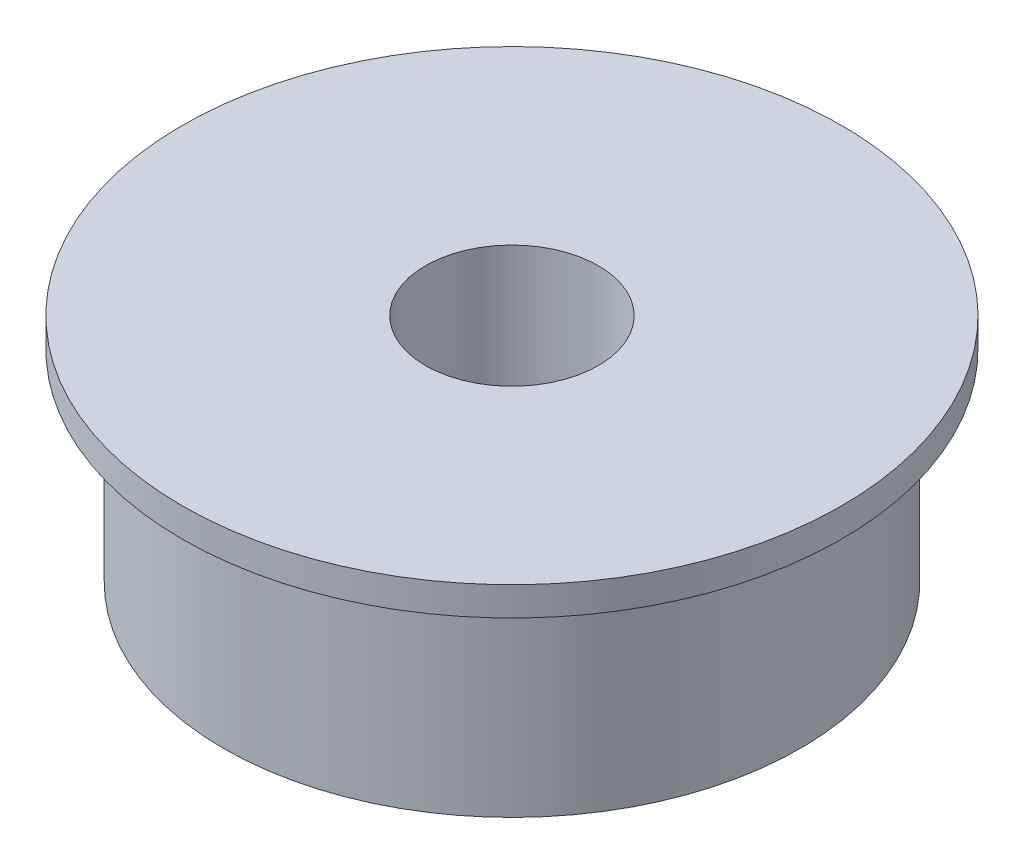
ISO-10303-21;
HEADER;
FILE_DESCRIPTION(('STEP AP214'),'2;1');
FILE_NAME('part.step','',(''),(''),'','','');
FILE_SCHEMA(('AUTOMOTIVE_DESIGN { 1 0 10303 214 1 1 1 1 }'));
ENDSEC;
DATA;
#1=APPLICATION_CONTEXT('core data for automotive mechanical design processes');
#2=APPLICATION_PROTOCOL_DEFINITION('international standard','automotive_design',2000,#1);
#3=PRODUCT_CONTEXT('',#1,'mechanical');
#4=PRODUCT('Part','Part','',(#3));
#5=PRODUCT_RELATED_PRODUCT_CATEGORY('part','',(#4));
#6=PRODUCT_DEFINITION_FORMATION('','',#4);
#7=PRODUCT_DEFINITION_CONTEXT('part definition',#1,'design');
#8=PRODUCT_DEFINITION('design','',#6,#7);
#9=PRODUCT_DEFINITION_SHAPE('','',#8);
#10=(LENGTH_UNIT() NAMED_UNIT(*) SI_UNIT(.MILLI.,.METRE.));
#11=(NAMED_UNIT(*) PLANE_ANGLE_UNIT() SI_UNIT($,.RADIAN.));
#12=(NAMED_UNIT(*) SI_UNIT($,.STERADIAN.) SOLID_ANGLE_UNIT());
#13=UNCERTAINTY_MEASURE_WITH_UNIT(LENGTH_MEASURE(1.E-05),#10,'distance_accuracy_value','');
#14=(GEOMETRIC_REPRESENTATION_CONTEXT(3) GLOBAL_UNCERTAINTY_ASSIGNED_CONTEXT((#13)) GLOBAL_UNIT_ASSIGNED_CONTEXT((#10,
#11,#12)) REPRESENTATION_CONTEXT('',''));
#15=CARTESIAN_POINT('',(0.,0.,0.));
#16=DIRECTION('',(0.,0.,1.));
#17=DIRECTION('',(1.,0.,0.));
#18=AXIS2_PLACEMENT_3D('',#15,#16,#17);
#19=CARTESIAN_POINT('',(0.,3.499993,0.));
#20=DIRECTION('',(0.,-1.,0.));
#21=DIRECTION('',(0.,0.,-1.));
#22=AXIS2_PLACEMENT_3D('',#19,#20,#21);
#23=CYLINDRICAL_SURFACE('',#22,5.);
#24=CARTESIAN_POINT('',(0.,3.499993,0.));
#25=DIRECTION('',(0.,1.,0.));
#26=DIRECTION('',(0.,0.,1.));
#27=AXIS2_PLACEMENT_3D('',#24,#25,#26);
#28=CIRCLE('',#27,5.);
#29=CARTESIAN_POINT('',(0.,3.499993,5.));
#30=VERTEX_POINT('',#29);
#31=EDGE_CURVE('E10',#30,#30,#28,.T.);
#32=ORIENTED_EDGE('',*,*,#31,.F.);
#33=EDGE_LOOP('',(#32));
#34=FACE_BOUND('',#33,.T.);
#35=CARTESIAN_POINT('',(0.,0.,0.));
#36=DIRECTION('',(0.,1.,0.));
#37=DIRECTION('',(0.,0.,1.));
#38=AXIS2_PLACEMENT_3D('',#35,#36,#37);
#39=CIRCLE('',#38,5.);
#40=CARTESIAN_POINT('',(0.,0.,5.));
#41=VERTEX_POINT('',#40);
#42=EDGE_CURVE('E34',#41,#41,#39,.T.);
#43=ORIENTED_EDGE('',*,*,#42,.T.);
#44=EDGE_LOOP('',(#43));
#45=FACE_BOUND('',#44,.T.);
#46=ADVANCED_FACE('F31',(#34,#45),#23,.T.);
#47=CARTESIAN_POINT('',(0.,0.,0.));
#48=DIRECTION('',(0.,1.,0.));
#49=DIRECTION('',(0.,0.,1.));
#50=AXIS2_PLACEMENT_3D('',#47,#48,#49);
#51=PLANE('',#50);
#52=CARTESIAN_POINT('',(0.,0.,0.));
#53=DIRECTION('',(0.,1.,0.));
#54=DIRECTION('',(0.,0.,1.));
#55=AXIS2_PLACEMENT_3D('',#52,#53,#54);
#56=CIRCLE('',#55,1.5);
#57=CARTESIAN_POINT('',(0.,0.,1.5));
#58=VERTEX_POINT('',#57);
#59=EDGE_CURVE('E46',#58,#58,#56,.F.);
#60=ORIENTED_EDGE('',*,*,#59,.F.);
#61=EDGE_LOOP('',(#60));
#62=FACE_BOUND('',#61,.T.);
#63=ORIENTED_EDGE('',*,*,#42,.F.);
#64=EDGE_LOOP('',(#63));
#65=FACE_BOUND('',#64,.T.);
#66=ADVANCED_FACE('F68',(#62,#65),#51,.F.);
#67=CARTESIAN_POINT('',(0.,4.0005,0.));
#68=DIRECTION('',(0.,-1.,0.));
#69=DIRECTION('',(0.,0.,-1.));
#70=AXIS2_PLACEMENT_3D('',#67,#68,#69);
#71=CYLINDRICAL_SURFACE('',#70,5.715);
#72=CARTESIAN_POINT('',(0.,4.0005,0.));
#73=DIRECTION('',(0.,1.,0.));
#74=DIRECTION('',(0.,0.,1.));
#75=AXIS2_PLACEMENT_3D('',#72,#73,#74);
#76=CIRCLE('',#75,5.715);
#77=CARTESIAN_POINT('',(0.,4.0005,5.715));
#78=VERTEX_POINT('',#77);
#79=EDGE_CURVE('E41',#78,#78,#76,.T.);
#80=ORIENTED_EDGE('',*,*,#79,.F.);
#81=EDGE_LOOP('',(#80));
#82=FACE_BOUND('',#81,.T.);
#83=CARTESIAN_POINT('',(0.,3.499993,0.));
#84=DIRECTION('',(0.,1.,0.));
#85=DIRECTION('',(0.,0.,1.));
#86=AXIS2_PLACEMENT_3D('',#83,#84,#85);
#87=CIRCLE('',#86,5.715);
#88=CARTESIAN_POINT('',(0.,3.499993,5.715));
#89=VERTEX_POINT('',#88);
#90=EDGE_CURVE('E43',#89,#89,#87,.T.);
#91=ORIENTED_EDGE('',*,*,#90,.T.);
#92=EDGE_LOOP('',(#91));
#93=FACE_BOUND('',#92,.T.);
#94=ADVANCED_FACE('F62',(#82,#93),#71,.T.);
#95=CARTESIAN_POINT('',(0.,4.0005,0.));
#96=DIRECTION('',(0.,1.,0.));
#97=DIRECTION('',(0.,0.,1.));
#98=AXIS2_PLACEMENT_3D('',#95,#96,#97);
#99=PLANE('',#98);
#100=CARTESIAN_POINT('',(0.,4.0005,0.));
#101=DIRECTION('',(0.,1.,0.));
#102=DIRECTION('',(0.,0.,1.));
#103=AXIS2_PLACEMENT_3D('',#100,#101,#102);
#104=CIRCLE('',#103,1.5);
#105=CARTESIAN_POINT('',(0.,4.0005,1.5));
#106=VERTEX_POINT('',#105);
#107=EDGE_CURVE('E51',#106,#106,#104,.T.);
#108=ORIENTED_EDGE('',*,*,#107,.F.);
#109=EDGE_LOOP('',(#108));
#110=FACE_BOUND('',#109,.T.);
#111=ORIENTED_EDGE('',*,*,#79,.T.);
#112=EDGE_LOOP('',(#111));
#113=FACE_BOUND('',#112,.T.);
#114=ADVANCED_FACE('F58',(#110,#113),#99,.T.);
#115=CARTESIAN_POINT('',(0.,3.499993,0.));
#116=DIRECTION('',(0.,1.,0.));
#117=DIRECTION('',(0.,0.,1.));
#118=AXIS2_PLACEMENT_3D('',#115,#116,#117);
#119=PLANE('',#118);
#120=ORIENTED_EDGE('',*,*,#31,.T.);
#121=EDGE_LOOP('',(#120));
#122=FACE_BOUND('',#121,.T.);
#123=ORIENTED_EDGE('',*,*,#90,.F.);
#124=EDGE_LOOP('',(#123));
#125=FACE_BOUND('',#124,.T.);
#126=ADVANCED_FACE('F61',(#122,#125),#119,.F.);
#127=CARTESIAN_POINT('',(0.,-0.00100000000000013,0.));
#128=DIRECTION('',(0.,1.,0.));
#129=DIRECTION('',(0.,0.,1.));
#130=AXIS2_PLACEMENT_3D('',#127,#128,#129);
#131=CYLINDRICAL_SURFACE('',#130,1.5);
#132=ORIENTED_EDGE('',*,*,#107,.T.);
#133=EDGE_LOOP('',(#132));
#134=FACE_BOUND('',#133,.T.);
#135=ORIENTED_EDGE('',*,*,#59,.T.);
#136=EDGE_LOOP('',(#135));
#137=FACE_BOUND('',#136,.T.);
#138=ADVANCED_FACE('F55',(#134,#137),#131,.F.);
#139=CLOSED_SHELL('',(#46,#66,#94,#114,#126,#138));
#140=MANIFOLD_SOLID_BREP('B2',#139);
#141=ADVANCED_BREP_SHAPE_REPRESENTATION('',(#18,#140),#14);
#142=SHAPE_DEFINITION_REPRESENTATION(#9,#141);
ENDSEC;
END-ISO-10303-21;
